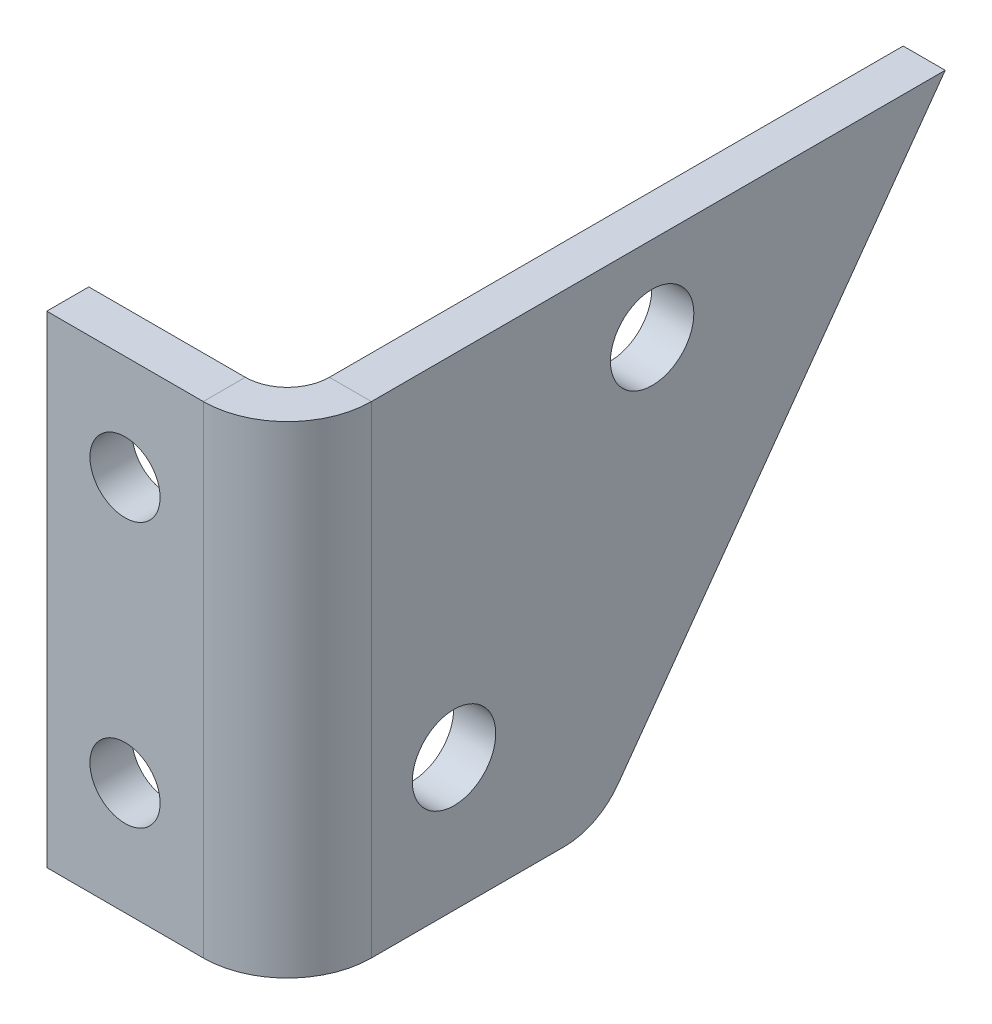
ISO-10303-21;
HEADER;
FILE_DESCRIPTION(('STEP AP214'),'2;1');
FILE_NAME('part.step','',(''),(''),'','','');
FILE_SCHEMA(('AUTOMOTIVE_DESIGN { 1 0 10303 214 1 1 1 1 }'));
ENDSEC;
DATA;
#1=APPLICATION_CONTEXT('core data for automotive mechanical design processes');
#2=APPLICATION_PROTOCOL_DEFINITION('international standard','automotive_design',2000,#1);
#3=PRODUCT_CONTEXT('',#1,'mechanical');
#4=PRODUCT('Part','Part','',(#3));
#5=PRODUCT_RELATED_PRODUCT_CATEGORY('part','',(#4));
#6=PRODUCT_DEFINITION_FORMATION('','',#4);
#7=PRODUCT_DEFINITION_CONTEXT('part definition',#1,'design');
#8=PRODUCT_DEFINITION('design','',#6,#7);
#9=PRODUCT_DEFINITION_SHAPE('','',#8);
#10=(LENGTH_UNIT() NAMED_UNIT(*) SI_UNIT(.MILLI.,.METRE.));
#11=(NAMED_UNIT(*) PLANE_ANGLE_UNIT() SI_UNIT($,.RADIAN.));
#12=(NAMED_UNIT(*) SI_UNIT($,.STERADIAN.) SOLID_ANGLE_UNIT());
#13=UNCERTAINTY_MEASURE_WITH_UNIT(LENGTH_MEASURE(1.E-05),#10,'distance_accuracy_value','');
#14=(GEOMETRIC_REPRESENTATION_CONTEXT(3) GLOBAL_UNCERTAINTY_ASSIGNED_CONTEXT((#13)) GLOBAL_UNIT_ASSIGNED_CONTEXT((#10,
#11,#12)) REPRESENTATION_CONTEXT('',''));
#15=CARTESIAN_POINT('',(0.,0.,0.));
#16=DIRECTION('',(0.,0.,1.));
#17=DIRECTION('',(1.,0.,0.));
#18=AXIS2_PLACEMENT_3D('',#15,#16,#17);
#19=CARTESIAN_POINT('',(-3.175,36.4039753296287,0.));
#20=DIRECTION('',(0.,1.,0.));
#21=DIRECTION('',(0.,0.,1.));
#22=AXIS2_PLACEMENT_3D('',#19,#20,#21);
#23=PLANE('',#22);
#24=DIRECTION('',(0.,0.,1.));
#25=VECTOR('',#24,1.);
#26=CARTESIAN_POINT('',(-3.175,36.4039753296287,0.));
#27=LINE('',#26,#25);
#28=CARTESIAN_POINT('',(-3.175,36.4039753296287,-49.6932453917724));
#29=VERTEX_POINT('',#28);
#30=CARTESIAN_POINT('',(-3.17499999999999,36.4039753296287,-6.34999999999999));
#31=VERTEX_POINT('',#30);
#32=EDGE_CURVE('E230',#29,#31,#27,.T.);
#33=ORIENTED_EDGE('',*,*,#32,.T.);
#34=DIRECTION('',(1.,0.,0.));
#35=VECTOR('',#34,1.);
#36=CARTESIAN_POINT('',(-3.17499999999999,36.4039753296287,-6.34999999999999));
#37=LINE('',#36,#35);
#38=CARTESIAN_POINT('',(0.,36.4039753296287,-6.34999999999999));
#39=VERTEX_POINT('',#38);
#40=EDGE_CURVE('E201',#31,#39,#37,.T.);
#41=ORIENTED_EDGE('',*,*,#40,.T.);
#42=DIRECTION('',(0.,0.,1.));
#43=VECTOR('',#42,1.);
#44=CARTESIAN_POINT('',(0.,36.4039753296287,0.));
#45=LINE('',#44,#43);
#46=CARTESIAN_POINT('',(0.,36.4039753296287,-49.6932453917724));
#47=VERTEX_POINT('',#46);
#48=EDGE_CURVE('E225',#47,#39,#45,.T.);
#49=ORIENTED_EDGE('',*,*,#48,.F.);
#50=DIRECTION('',(1.,0.,0.));
#51=VECTOR('',#50,1.);
#52=CARTESIAN_POINT('',(-3.175,36.4039753296287,-49.6932453917724));
#53=LINE('',#52,#51);
#54=EDGE_CURVE('E13',#29,#47,#53,.T.);
#55=ORIENTED_EDGE('',*,*,#54,.F.);
#56=EDGE_LOOP('',(#33,#41,#49,#55));
#57=FACE_BOUND('',#56,.T.);
#58=ADVANCED_FACE('F72',(#57),#23,.T.);
#59=CARTESIAN_POINT('',(-3.175,5.,-20.9310692511495));
#60=DIRECTION('',(1.,0.,0.));
#61=DIRECTION('',(0.,0.,-1.));
#62=AXIS2_PLACEMENT_3D('',#59,#60,#61);
#63=PLANE('',#62);
#64=CARTESIAN_POINT('',(-3.175,10.,-12.5876713691336));
#65=DIRECTION('',(-1.,0.,0.));
#66=DIRECTION('',(0.,0.,1.));
#67=AXIS2_PLACEMENT_3D('',#64,#65,#66);
#68=CIRCLE('',#67,3.15);
#69=CARTESIAN_POINT('',(-3.175,10.,-9.43767136913363));
#70=VERTEX_POINT('',#69);
#71=EDGE_CURVE('E214',#70,#70,#68,.T.);
#72=ORIENTED_EDGE('',*,*,#71,.F.);
#73=EDGE_LOOP('',(#72));
#74=FACE_BOUND('',#73,.T.);
#75=CARTESIAN_POINT('',(-3.175,30.,-27.5538986944384));
#76=DIRECTION('',(-1.,0.,0.));
#77=DIRECTION('',(0.,0.,1.));
#78=AXIS2_PLACEMENT_3D('',#75,#76,#77);
#79=CIRCLE('',#78,3.15);
#80=CARTESIAN_POINT('',(-3.175,30.,-24.4038986944384));
#81=VERTEX_POINT('',#80);
#82=EDGE_CURVE('E217',#81,#81,#79,.T.);
#83=ORIENTED_EDGE('',*,*,#82,.F.);
#84=EDGE_LOOP('',(#83));
#85=FACE_BOUND('',#84,.T.);
#86=DIRECTION('',(0.,1.,0.));
#87=VECTOR('',#86,1.);
#88=CARTESIAN_POINT('',(-3.17499999999999,36.4039753296287,-6.34999999999999));
#89=LINE('',#88,#87);
#90=CARTESIAN_POINT('',(-3.17499999999999,0.,-6.34999999999999));
#91=VERTEX_POINT('',#90);
#92=EDGE_CURVE('E207',#31,#91,#89,.F.);
#93=ORIENTED_EDGE('',*,*,#92,.F.);
#94=ORIENTED_EDGE('',*,*,#32,.F.);
#95=DIRECTION('',(0.,0.811644823532769,-0.584151247907988));
#96=VECTOR('',#95,1.);
#97=CARTESIAN_POINT('',(-3.175,2.07924376046009,-24.9892933688134));
#98=LINE('',#97,#96);
#99=CARTESIAN_POINT('',(-3.175,2.07924376046009,-24.9892933688134));
#100=VERTEX_POINT('',#99);
#101=EDGE_CURVE('E228',#100,#29,#98,.T.);
#102=ORIENTED_EDGE('',*,*,#101,.F.);
#103=CARTESIAN_POINT('',(-3.175,5.,-20.9310692511495));
#104=DIRECTION('',(1.,0.,0.));
#105=DIRECTION('',(0.,0.,-1.));
#106=AXIS2_PLACEMENT_3D('',#103,#104,#105);
#107=CIRCLE('',#106,5.00000000000001);
#108=CARTESIAN_POINT('',(-3.175,0.,-20.9310692511495));
#109=VERTEX_POINT('',#108);
#110=EDGE_CURVE('E224',#109,#100,#107,.T.);
#111=ORIENTED_EDGE('',*,*,#110,.F.);
#112=DIRECTION('',(0.,0.,-1.));
#113=VECTOR('',#112,1.);
#114=CARTESIAN_POINT('',(-3.175,0.,0.));
#115=LINE('',#114,#113);
#116=EDGE_CURVE('E118',#91,#109,#115,.T.);
#117=ORIENTED_EDGE('',*,*,#116,.F.);
#118=EDGE_LOOP('',(#93,#94,#102,#111,#117));
#119=FACE_BOUND('',#118,.T.);
#120=ADVANCED_FACE('F256',(#74,#85,#119),#63,.F.);
#121=CARTESIAN_POINT('',(0.,5.,-20.9310692511495));
#122=DIRECTION('',(1.,0.,0.));
#123=DIRECTION('',(0.,0.,-1.));
#124=AXIS2_PLACEMENT_3D('',#121,#122,#123);
#125=PLANE('',#124);
#126=CARTESIAN_POINT('',(0.,30.,-27.5538986944384));
#127=DIRECTION('',(1.,0.,0.));
#128=DIRECTION('',(0.,0.,-1.));
#129=AXIS2_PLACEMENT_3D('',#126,#127,#128);
#130=CIRCLE('',#129,3.15);
#131=CARTESIAN_POINT('',(0.,30.,-30.7038986944384));
#132=VERTEX_POINT('',#131);
#133=EDGE_CURVE('E76',#132,#132,#130,.T.);
#134=ORIENTED_EDGE('',*,*,#133,.F.);
#135=EDGE_LOOP('',(#134));
#136=FACE_BOUND('',#135,.T.);
#137=CARTESIAN_POINT('',(0.,10.,-12.5876713691336));
#138=DIRECTION('',(1.,0.,0.));
#139=DIRECTION('',(0.,0.,-1.));
#140=AXIS2_PLACEMENT_3D('',#137,#138,#139);
#141=CIRCLE('',#140,3.15);
#142=CARTESIAN_POINT('',(0.,10.,-15.7376713691336));
#143=VERTEX_POINT('',#142);
#144=EDGE_CURVE('E220',#143,#143,#141,.T.);
#145=ORIENTED_EDGE('',*,*,#144,.F.);
#146=EDGE_LOOP('',(#145));
#147=FACE_BOUND('',#146,.T.);
#148=ORIENTED_EDGE('',*,*,#48,.T.);
#149=DIRECTION('',(0.,1.,0.));
#150=VECTOR('',#149,1.);
#151=CARTESIAN_POINT('',(0.,36.4039753296287,-6.34999999999999));
#152=LINE('',#151,#150);
#153=CARTESIAN_POINT('',(0.,0.,-6.34999999999999));
#154=VERTEX_POINT('',#153);
#155=EDGE_CURVE('E196',#39,#154,#152,.F.);
#156=ORIENTED_EDGE('',*,*,#155,.T.);
#157=DIRECTION('',(0.,0.,-1.));
#158=VECTOR('',#157,1.);
#159=CARTESIAN_POINT('',(0.,0.,0.));
#160=LINE('',#159,#158);
#161=CARTESIAN_POINT('',(0.,0.,-20.9310692511495));
#162=VERTEX_POINT('',#161);
#163=EDGE_CURVE('E233',#154,#162,#160,.T.);
#164=ORIENTED_EDGE('',*,*,#163,.T.);
#165=CARTESIAN_POINT('',(0.,5.,-20.9310692511495));
#166=DIRECTION('',(1.,0.,0.));
#167=DIRECTION('',(0.,0.,-1.));
#168=AXIS2_PLACEMENT_3D('',#165,#166,#167);
#169=CIRCLE('',#168,5.00000000000001);
#170=CARTESIAN_POINT('',(0.,2.07924376046009,-24.9892933688134));
#171=VERTEX_POINT('',#170);
#172=EDGE_CURVE('E235',#162,#171,#169,.T.);
#173=ORIENTED_EDGE('',*,*,#172,.T.);
#174=DIRECTION('',(0.,0.811644823532769,-0.584151247907988));
#175=VECTOR('',#174,1.);
#176=CARTESIAN_POINT('',(0.,2.07924376046009,-24.9892933688134));
#177=LINE('',#176,#175);
#178=EDGE_CURVE('E238',#171,#47,#177,.T.);
#179=ORIENTED_EDGE('',*,*,#178,.T.);
#180=EDGE_LOOP('',(#148,#156,#164,#173,#179));
#181=FACE_BOUND('',#180,.T.);
#182=ADVANCED_FACE('F253',(#136,#147,#181),#125,.T.);
#183=CARTESIAN_POINT('',(-3.175,0.,0.));
#184=DIRECTION('',(0.,-1.,0.));
#185=DIRECTION('',(0.,0.,-1.));
#186=AXIS2_PLACEMENT_3D('',#183,#184,#185);
#187=PLANE('',#186);
#188=DIRECTION('',(1.,0.,0.));
#189=VECTOR('',#188,1.);
#190=CARTESIAN_POINT('',(-3.17499999999999,0.,-6.34999999999999));
#191=LINE('',#190,#189);
#192=EDGE_CURVE('E212',#91,#154,#191,.T.);
#193=ORIENTED_EDGE('',*,*,#192,.F.);
#194=ORIENTED_EDGE('',*,*,#116,.T.);
#195=DIRECTION('',(1.,0.,0.));
#196=VECTOR('',#195,1.);
#197=CARTESIAN_POINT('',(-3.175,0.,-20.9310692511495));
#198=LINE('',#197,#196);
#199=EDGE_CURVE('E232',#109,#162,#198,.T.);
#200=ORIENTED_EDGE('',*,*,#199,.T.);
#201=ORIENTED_EDGE('',*,*,#163,.F.);
#202=EDGE_LOOP('',(#193,#194,#200,#201));
#203=FACE_BOUND('',#202,.T.);
#204=ADVANCED_FACE('F74',(#203),#187,.T.);
#205=CARTESIAN_POINT('',(-3.175,2.07924376046009,-24.9892933688134));
#206=DIRECTION('',(0.,-0.584151247907988,-0.811644823532769));
#207=DIRECTION('',(0.,0.81164482353277,-0.584151247907988));
#208=AXIS2_PLACEMENT_3D('',#205,#206,#207);
#209=PLANE('',#208);
#210=ORIENTED_EDGE('',*,*,#178,.F.);
#211=DIRECTION('',(1.,0.,0.));
#212=VECTOR('',#211,1.);
#213=CARTESIAN_POINT('',(-3.175,2.07924376046009,-24.9892933688134));
#214=LINE('',#213,#212);
#215=EDGE_CURVE('E81',#100,#171,#214,.T.);
#216=ORIENTED_EDGE('',*,*,#215,.F.);
#217=ORIENTED_EDGE('',*,*,#101,.T.);
#218=ORIENTED_EDGE('',*,*,#54,.T.);
#219=EDGE_LOOP('',(#210,#216,#217,#218));
#220=FACE_BOUND('',#219,.T.);
#221=ADVANCED_FACE('F326',(#220),#209,.T.);
#222=CARTESIAN_POINT('',(-3.175,5.,-20.9310692511495));
#223=DIRECTION('',(1.,0.,0.));
#224=DIRECTION('',(0.,0.,-1.));
#225=AXIS2_PLACEMENT_3D('',#222,#223,#224);
#226=CYLINDRICAL_SURFACE('',#225,5.00000000000001);
#227=ORIENTED_EDGE('',*,*,#172,.F.);
#228=ORIENTED_EDGE('',*,*,#199,.F.);
#229=ORIENTED_EDGE('',*,*,#110,.T.);
#230=ORIENTED_EDGE('',*,*,#215,.T.);
#231=EDGE_LOOP('',(#227,#228,#229,#230));
#232=FACE_BOUND('',#231,.T.);
#233=ADVANCED_FACE('F274',(#232),#226,.T.);
#234=CARTESIAN_POINT('',(6.825,10.,-12.5876713691336));
#235=DIRECTION('',(-1.,0.,0.));
#236=DIRECTION('',(0.,0.,1.));
#237=AXIS2_PLACEMENT_3D('',#234,#235,#236);
#238=CYLINDRICAL_SURFACE('',#237,3.15);
#239=ORIENTED_EDGE('',*,*,#144,.T.);
#240=EDGE_LOOP('',(#239));
#241=FACE_BOUND('',#240,.T.);
#242=ORIENTED_EDGE('',*,*,#71,.T.);
#243=EDGE_LOOP('',(#242));
#244=FACE_BOUND('',#243,.T.);
#245=ADVANCED_FACE('F329',(#241,#244),#238,.F.);
#246=CARTESIAN_POINT('',(6.825,30.,-27.5538986944384));
#247=DIRECTION('',(-1.,0.,0.));
#248=DIRECTION('',(0.,0.,1.));
#249=AXIS2_PLACEMENT_3D('',#246,#247,#248);
#250=CYLINDRICAL_SURFACE('',#249,3.15);
#251=ORIENTED_EDGE('',*,*,#133,.T.);
#252=EDGE_LOOP('',(#251));
#253=FACE_BOUND('',#252,.T.);
#254=ORIENTED_EDGE('',*,*,#82,.T.);
#255=EDGE_LOOP('',(#254));
#256=FACE_BOUND('',#255,.T.);
#257=ADVANCED_FACE('F250',(#253,#256),#250,.F.);
#258=CARTESIAN_POINT('',(-6.34999999999999,0.,-6.34999999999999));
#259=DIRECTION('',(0.,-1.,0.));
#260=DIRECTION('',(0.,0.,-1.));
#261=AXIS2_PLACEMENT_3D('',#258,#259,#260);
#262=PLANE('',#261);
#263=DIRECTION('',(0.,0.,-1.));
#264=VECTOR('',#263,1.);
#265=CARTESIAN_POINT('',(-6.34999999999999,0.,0.));
#266=LINE('',#265,#264);
#267=CARTESIAN_POINT('',(-6.34999999999998,0.,-3.17499999999999));
#268=VERTEX_POINT('',#267);
#269=CARTESIAN_POINT('',(-6.34999999999997,0.,0.));
#270=VERTEX_POINT('',#269);
#271=EDGE_CURVE('E177',#268,#270,#266,.F.);
#272=ORIENTED_EDGE('',*,*,#271,.F.);
#273=CARTESIAN_POINT('',(-6.34999999999999,0.,-6.34999999999999));
#274=DIRECTION('',(0.,1.,0.));
#275=DIRECTION('',(0.,0.,1.));
#276=AXIS2_PLACEMENT_3D('',#273,#274,#275);
#277=CIRCLE('',#276,3.175);
#278=EDGE_CURVE('E204',#91,#268,#277,.F.);
#279=ORIENTED_EDGE('',*,*,#278,.F.);
#280=ORIENTED_EDGE('',*,*,#192,.T.);
#281=CARTESIAN_POINT('',(-6.34999999999999,0.,-6.34999999999999));
#282=DIRECTION('',(0.,1.,0.));
#283=DIRECTION('',(0.,0.,1.));
#284=AXIS2_PLACEMENT_3D('',#281,#282,#283);
#285=CIRCLE('',#284,6.35);
#286=EDGE_CURVE('E89',#154,#270,#285,.F.);
#287=ORIENTED_EDGE('',*,*,#286,.T.);
#288=EDGE_LOOP('',(#272,#279,#280,#287));
#289=FACE_BOUND('',#288,.T.);
#290=ADVANCED_FACE('F276',(#289),#262,.T.);
#291=CARTESIAN_POINT('',(-6.34999999999999,36.4039753296287,-6.34999999999999));
#292=DIRECTION('',(0.,-1.,0.));
#293=DIRECTION('',(0.,0.,-1.));
#294=AXIS2_PLACEMENT_3D('',#291,#292,#293);
#295=PLANE('',#294);
#296=CARTESIAN_POINT('',(-6.34999999999999,36.4039753296287,-6.34999999999999));
#297=DIRECTION('',(0.,1.,0.));
#298=DIRECTION('',(0.,0.,1.));
#299=AXIS2_PLACEMENT_3D('',#296,#297,#298);
#300=CIRCLE('',#299,3.175);
#301=CARTESIAN_POINT('',(-6.34999999999998,36.4039753296287,-3.17499999999999));
#302=VERTEX_POINT('',#301);
#303=EDGE_CURVE('E209',#302,#31,#300,.T.);
#304=ORIENTED_EDGE('',*,*,#303,.F.);
#305=DIRECTION('',(0.,0.,-1.));
#306=VECTOR('',#305,1.);
#307=CARTESIAN_POINT('',(-6.34999999999999,36.4039753296287,-3.17499999999999));
#308=LINE('',#307,#306);
#309=CARTESIAN_POINT('',(-6.34999999999999,36.4039753296287,0.));
#310=VERTEX_POINT('',#309);
#311=EDGE_CURVE('E189',#302,#310,#308,.F.);
#312=ORIENTED_EDGE('',*,*,#311,.T.);
#313=CARTESIAN_POINT('',(-6.34999999999999,36.4039753296287,-6.34999999999999));
#314=DIRECTION('',(0.,1.,0.));
#315=DIRECTION('',(0.,0.,1.));
#316=AXIS2_PLACEMENT_3D('',#313,#314,#315);
#317=CIRCLE('',#316,6.35);
#318=EDGE_CURVE('E199',#310,#39,#317,.T.);
#319=ORIENTED_EDGE('',*,*,#318,.T.);
#320=ORIENTED_EDGE('',*,*,#40,.F.);
#321=EDGE_LOOP('',(#304,#312,#319,#320));
#322=FACE_BOUND('',#321,.T.);
#323=ADVANCED_FACE('F262',(#322),#295,.F.);
#324=CARTESIAN_POINT('',(-6.34999999999999,36.4039753296287,-6.34999999999999));
#325=DIRECTION('',(0.,1.,0.));
#326=DIRECTION('',(0.,0.,1.));
#327=AXIS2_PLACEMENT_3D('',#324,#325,#326);
#328=CYLINDRICAL_SURFACE('',#327,6.35);
#329=ORIENTED_EDGE('',*,*,#155,.F.);
#330=ORIENTED_EDGE('',*,*,#318,.F.);
#331=DIRECTION('',(0.,1.,0.));
#332=VECTOR('',#331,1.);
#333=CARTESIAN_POINT('',(-6.34999999999999,0.,0.));
#334=LINE('',#333,#332);
#335=EDGE_CURVE('E187',#310,#270,#334,.F.);
#336=ORIENTED_EDGE('',*,*,#335,.T.);
#337=ORIENTED_EDGE('',*,*,#286,.F.);
#338=EDGE_LOOP('',(#329,#330,#336,#337));
#339=FACE_BOUND('',#338,.T.);
#340=ADVANCED_FACE('F341',(#339),#328,.T.);
#341=CARTESIAN_POINT('',(-6.34999999999999,36.4039753296287,-6.34999999999999));
#342=DIRECTION('',(0.,1.,0.));
#343=DIRECTION('',(0.,0.,1.));
#344=AXIS2_PLACEMENT_3D('',#341,#342,#343);
#345=CYLINDRICAL_SURFACE('',#344,3.175);
#346=ORIENTED_EDGE('',*,*,#92,.T.);
#347=ORIENTED_EDGE('',*,*,#278,.T.);
#348=DIRECTION('',(0.,1.,0.));
#349=VECTOR('',#348,1.);
#350=CARTESIAN_POINT('',(-6.34999999999999,0.,-3.17499999999999));
#351=LINE('',#350,#349);
#352=EDGE_CURVE('E192',#268,#302,#351,.T.);
#353=ORIENTED_EDGE('',*,*,#352,.T.);
#354=ORIENTED_EDGE('',*,*,#303,.T.);
#355=EDGE_LOOP('',(#346,#347,#353,#354));
#356=FACE_BOUND('',#355,.T.);
#357=ADVANCED_FACE('F266',(#356),#345,.F.);
#358=CARTESIAN_POINT('',(-18.175,36.4039753296287,0.));
#359=DIRECTION('',(0.,-1.,0.));
#360=DIRECTION('',(0.,0.,-1.));
#361=AXIS2_PLACEMENT_3D('',#358,#359,#360);
#362=PLANE('',#361);
#363=ORIENTED_EDGE('',*,*,#311,.F.);
#364=DIRECTION('',(1.,0.,0.));
#365=VECTOR('',#364,1.);
#366=CARTESIAN_POINT('',(-18.175,36.4039753296287,-3.17499999999995));
#367=LINE('',#366,#365);
#368=CARTESIAN_POINT('',(-18.175,36.4039753296287,-3.17499999999995));
#369=VERTEX_POINT('',#368);
#370=EDGE_CURVE('E185',#302,#369,#367,.F.);
#371=ORIENTED_EDGE('',*,*,#370,.T.);
#372=DIRECTION('',(0.,0.,-1.));
#373=VECTOR('',#372,1.);
#374=CARTESIAN_POINT('',(-18.175,36.4039753296287,0.));
#375=LINE('',#374,#373);
#376=CARTESIAN_POINT('',(-18.175,36.4039753296287,0.));
#377=VERTEX_POINT('',#376);
#378=EDGE_CURVE('E173',#377,#369,#375,.T.);
#379=ORIENTED_EDGE('',*,*,#378,.F.);
#380=DIRECTION('',(-1.,0.,0.));
#381=VECTOR('',#380,1.);
#382=CARTESIAN_POINT('',(0.,36.4039753296287,0.));
#383=LINE('',#382,#381);
#384=EDGE_CURVE('E160',#310,#377,#383,.T.);
#385=ORIENTED_EDGE('',*,*,#384,.F.);
#386=EDGE_LOOP('',(#363,#371,#379,#385));
#387=FACE_BOUND('',#386,.T.);
#388=ADVANCED_FACE('F281',(#387),#362,.F.);
#389=CARTESIAN_POINT('',(-3.17499999999999,0.,0.));
#390=DIRECTION('',(0.,1.,0.));
#391=DIRECTION('',(0.,0.,1.));
#392=AXIS2_PLACEMENT_3D('',#389,#390,#391);
#393=PLANE('',#392);
#394=ORIENTED_EDGE('',*,*,#271,.T.);
#395=DIRECTION('',(1.,0.,0.));
#396=VECTOR('',#395,1.);
#397=CARTESIAN_POINT('',(0.,0.,0.));
#398=LINE('',#397,#396);
#399=CARTESIAN_POINT('',(-18.175,0.,0.));
#400=VERTEX_POINT('',#399);
#401=EDGE_CURVE('E158',#400,#270,#398,.T.);
#402=ORIENTED_EDGE('',*,*,#401,.F.);
#403=DIRECTION('',(0.,0.,-1.));
#404=VECTOR('',#403,1.);
#405=CARTESIAN_POINT('',(-18.175,0.,0.));
#406=LINE('',#405,#404);
#407=CARTESIAN_POINT('',(-18.175,0.,-3.17499999999995));
#408=VERTEX_POINT('',#407);
#409=EDGE_CURVE('E166',#400,#408,#406,.T.);
#410=ORIENTED_EDGE('',*,*,#409,.T.);
#411=DIRECTION('',(-1.,0.,0.));
#412=VECTOR('',#411,1.);
#413=CARTESIAN_POINT('',(-3.175,0.,-3.175));
#414=LINE('',#413,#412);
#415=EDGE_CURVE('E182',#408,#268,#414,.F.);
#416=ORIENTED_EDGE('',*,*,#415,.T.);
#417=EDGE_LOOP('',(#394,#402,#410,#416));
#418=FACE_BOUND('',#417,.T.);
#419=ADVANCED_FACE('F176',(#418),#393,.F.);
#420=CARTESIAN_POINT('',(0.,0.,0.));
#421=DIRECTION('',(0.,0.,-1.));
#422=DIRECTION('',(-1.,0.,0.));
#423=AXIS2_PLACEMENT_3D('',#420,#421,#422);
#424=PLANE('',#423);
#425=CARTESIAN_POINT('',(-12.2625,8.49661673955412,0.));
#426=DIRECTION('',(0.,0.,-1.));
#427=DIRECTION('',(-1.,0.,0.));
#428=AXIS2_PLACEMENT_3D('',#425,#426,#427);
#429=CIRCLE('',#428,2.65);
#430=CARTESIAN_POINT('',(-14.9125,8.49661673955412,0.));
#431=VERTEX_POINT('',#430);
#432=EDGE_CURVE('E195',#431,#431,#429,.T.);
#433=ORIENTED_EDGE('',*,*,#432,.T.);
#434=EDGE_LOOP('',(#433));
#435=FACE_BOUND('',#434,.T.);
#436=CARTESIAN_POINT('',(-12.2625,28.4964162413409,0.));
#437=DIRECTION('',(0.,0.,-1.));
#438=DIRECTION('',(-1.,0.,0.));
#439=AXIS2_PLACEMENT_3D('',#436,#437,#438);
#440=CIRCLE('',#439,2.65);
#441=CARTESIAN_POINT('',(-14.9125,28.4964162413409,0.));
#442=VERTEX_POINT('',#441);
#443=EDGE_CURVE('E285',#442,#442,#440,.T.);
#444=ORIENTED_EDGE('',*,*,#443,.T.);
#445=EDGE_LOOP('',(#444));
#446=FACE_BOUND('',#445,.T.);
#447=ORIENTED_EDGE('',*,*,#335,.F.);
#448=ORIENTED_EDGE('',*,*,#384,.T.);
#449=DIRECTION('',(0.,-1.,0.));
#450=VECTOR('',#449,1.);
#451=CARTESIAN_POINT('',(-18.175,0.,0.));
#452=LINE('',#451,#450);
#453=EDGE_CURVE('E153',#377,#400,#452,.T.);
#454=ORIENTED_EDGE('',*,*,#453,.T.);
#455=ORIENTED_EDGE('',*,*,#401,.T.);
#456=EDGE_LOOP('',(#447,#448,#454,#455));
#457=FACE_BOUND('',#456,.T.);
#458=ADVANCED_FACE('F156',(#435,#446,#457),#424,.F.);
#459=CARTESIAN_POINT('',(0.,0.,-3.17500000000001));
#460=DIRECTION('',(0.,0.,-1.));
#461=DIRECTION('',(-1.,0.,0.));
#462=AXIS2_PLACEMENT_3D('',#459,#460,#461);
#463=PLANE('',#462);
#464=CARTESIAN_POINT('',(-12.2625,8.49661673955412,-3.17499999999997));
#465=DIRECTION('',(0.,0.,-1.));
#466=DIRECTION('',(-1.,0.,0.));
#467=AXIS2_PLACEMENT_3D('',#464,#465,#466);
#468=CIRCLE('',#467,2.65);
#469=CARTESIAN_POINT('',(-14.9125,8.49661673955412,-3.17499999999996));
#470=VERTEX_POINT('',#469);
#471=EDGE_CURVE('E288',#470,#470,#468,.T.);
#472=ORIENTED_EDGE('',*,*,#471,.F.);
#473=EDGE_LOOP('',(#472));
#474=FACE_BOUND('',#473,.T.);
#475=CARTESIAN_POINT('',(-12.2625,28.4964162413409,-3.17499999999997));
#476=DIRECTION('',(0.,0.,-1.));
#477=DIRECTION('',(-1.,0.,0.));
#478=AXIS2_PLACEMENT_3D('',#475,#476,#477);
#479=CIRCLE('',#478,2.65);
#480=CARTESIAN_POINT('',(-14.9125,28.4964162413409,-3.17499999999996));
#481=VERTEX_POINT('',#480);
#482=EDGE_CURVE('E289',#481,#481,#479,.T.);
#483=ORIENTED_EDGE('',*,*,#482,.F.);
#484=EDGE_LOOP('',(#483));
#485=FACE_BOUND('',#484,.T.);
#486=ORIENTED_EDGE('',*,*,#370,.F.);
#487=ORIENTED_EDGE('',*,*,#352,.F.);
#488=ORIENTED_EDGE('',*,*,#415,.F.);
#489=DIRECTION('',(0.,1.,0.));
#490=VECTOR('',#489,1.);
#491=CARTESIAN_POINT('',(-18.175,0.,-3.17499999999995));
#492=LINE('',#491,#490);
#493=EDGE_CURVE('E169',#369,#408,#492,.F.);
#494=ORIENTED_EDGE('',*,*,#493,.F.);
#495=EDGE_LOOP('',(#486,#487,#488,#494));
#496=FACE_BOUND('',#495,.T.);
#497=ADVANCED_FACE('F279',(#474,#485,#496),#463,.T.);
#498=CARTESIAN_POINT('',(-18.175,0.,0.));
#499=DIRECTION('',(1.,0.,0.));
#500=DIRECTION('',(0.,0.,-1.));
#501=AXIS2_PLACEMENT_3D('',#498,#499,#500);
#502=PLANE('',#501);
#503=ORIENTED_EDGE('',*,*,#493,.T.);
#504=ORIENTED_EDGE('',*,*,#409,.F.);
#505=ORIENTED_EDGE('',*,*,#453,.F.);
#506=ORIENTED_EDGE('',*,*,#378,.T.);
#507=EDGE_LOOP('',(#503,#504,#505,#506));
#508=FACE_BOUND('',#507,.T.);
#509=ADVANCED_FACE('F167',(#508),#502,.F.);
#510=CARTESIAN_POINT('',(-12.2625,28.4964162413409,6.82500000000003));
#511=DIRECTION('',(0.,0.,-1.));
#512=DIRECTION('',(-1.,0.,0.));
#513=AXIS2_PLACEMENT_3D('',#510,#511,#512);
#514=CYLINDRICAL_SURFACE('',#513,2.65);
#515=ORIENTED_EDGE('',*,*,#482,.T.);
#516=EDGE_LOOP('',(#515));
#517=FACE_BOUND('',#516,.T.);
#518=ORIENTED_EDGE('',*,*,#443,.F.);
#519=EDGE_LOOP('',(#518));
#520=FACE_BOUND('',#519,.T.);
#521=ADVANCED_FACE('F303',(#517,#520),#514,.F.);
#522=CARTESIAN_POINT('',(-12.2625,8.49661673955412,6.82500000000003));
#523=DIRECTION('',(0.,0.,-1.));
#524=DIRECTION('',(-1.,0.,0.));
#525=AXIS2_PLACEMENT_3D('',#522,#523,#524);
#526=CYLINDRICAL_SURFACE('',#525,2.65);
#527=ORIENTED_EDGE('',*,*,#471,.T.);
#528=EDGE_LOOP('',(#527));
#529=FACE_BOUND('',#528,.T.);
#530=ORIENTED_EDGE('',*,*,#432,.F.);
#531=EDGE_LOOP('',(#530));
#532=FACE_BOUND('',#531,.T.);
#533=ADVANCED_FACE('F295',(#529,#532),#526,.F.);
#534=CLOSED_SHELL('',(#58,#120,#182,#204,#221,#233,#245,#257,#290,#323,#340,#357,#388,#419,#458,
#497,#509,#521,#533));
#535=MANIFOLD_SOLID_BREP('B2',#534);
#536=ADVANCED_BREP_SHAPE_REPRESENTATION('',(#18,#535),#14);
#537=SHAPE_DEFINITION_REPRESENTATION(#9,#536);
ENDSEC;
END-ISO-10303-21;
